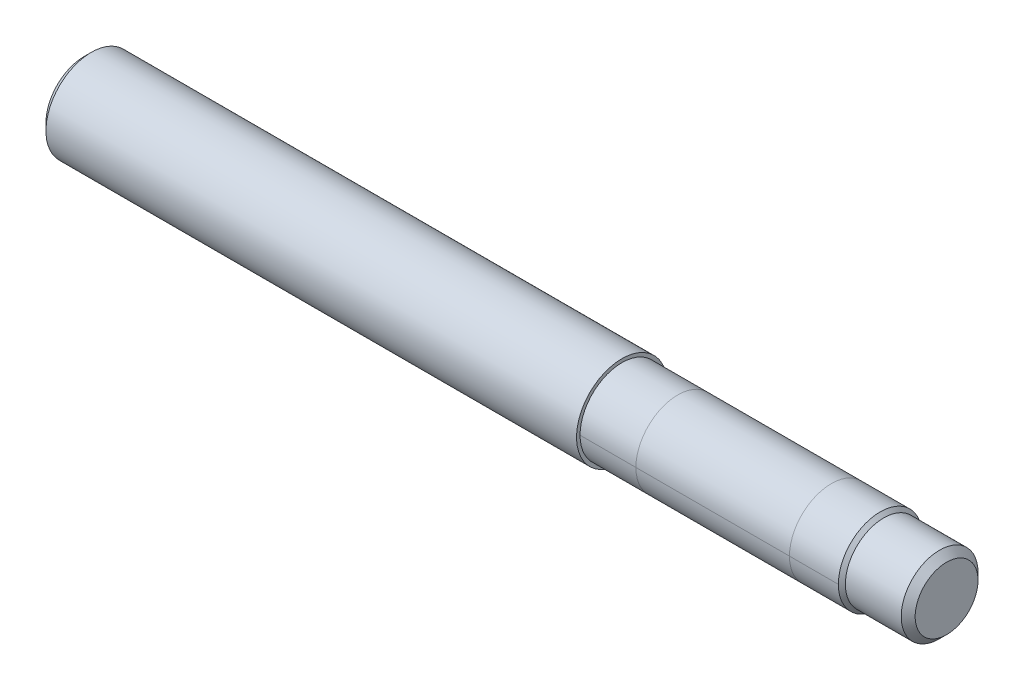
ISO-10303-21;
HEADER;
FILE_DESCRIPTION(('STEP AP214'),'2;1');
FILE_NAME('part.step','',(''),(''),'','','');
FILE_SCHEMA(('AUTOMOTIVE_DESIGN { 1 0 10303 214 1 1 1 1 }'));
ENDSEC;
DATA;
#1=APPLICATION_CONTEXT('core data for automotive mechanical design processes');
#2=APPLICATION_PROTOCOL_DEFINITION('international standard','automotive_design',2000,#1);
#3=PRODUCT_CONTEXT('',#1,'mechanical');
#4=PRODUCT('Part','Part','',(#3));
#5=PRODUCT_RELATED_PRODUCT_CATEGORY('part','',(#4));
#6=PRODUCT_DEFINITION_FORMATION('','',#4);
#7=PRODUCT_DEFINITION_CONTEXT('part definition',#1,'design');
#8=PRODUCT_DEFINITION('design','',#6,#7);
#9=PRODUCT_DEFINITION_SHAPE('','',#8);
#10=(LENGTH_UNIT() NAMED_UNIT(*) SI_UNIT(.MILLI.,.METRE.));
#11=(NAMED_UNIT(*) PLANE_ANGLE_UNIT() SI_UNIT($,.RADIAN.));
#12=(NAMED_UNIT(*) SI_UNIT($,.STERADIAN.) SOLID_ANGLE_UNIT());
#13=UNCERTAINTY_MEASURE_WITH_UNIT(LENGTH_MEASURE(1.E-05),#10,'distance_accuracy_value','');
#14=(GEOMETRIC_REPRESENTATION_CONTEXT(3) GLOBAL_UNCERTAINTY_ASSIGNED_CONTEXT((#13)) GLOBAL_UNIT_ASSIGNED_CONTEXT((#10,
#11,#12)) REPRESENTATION_CONTEXT('',''));
#15=CARTESIAN_POINT('',(0.,0.,0.));
#16=DIRECTION('',(0.,0.,1.));
#17=DIRECTION('',(1.,0.,0.));
#18=AXIS2_PLACEMENT_3D('',#15,#16,#17);
#19=CARTESIAN_POINT('',(77.,0.,0.));
#20=DIRECTION('',(1.,0.,0.));
#21=DIRECTION('',(0.,0.,-1.));
#22=AXIS2_PLACEMENT_3D('',#19,#20,#21);
#23=CYLINDRICAL_SURFACE('',#22,6.);
#24=CARTESIAN_POINT('',(106.9974,0.,0.));
#25=DIRECTION('',(1.,0.,0.));
#26=DIRECTION('',(0.,0.,-1.));
#27=AXIS2_PLACEMENT_3D('',#24,#25,#26);
#28=CIRCLE('',#27,6.);
#29=CARTESIAN_POINT('',(106.9974,0.,-6.));
#30=VERTEX_POINT('',#29);
#31=CARTESIAN_POINT('',(106.9974,-6.,0.));
#32=VERTEX_POINT('',#31);
#33=EDGE_CURVE('E43',#30,#32,#28,.F.);
#34=ORIENTED_EDGE('',*,*,#33,.T.);
#35=CARTESIAN_POINT('',(106.9974,0.,6.));
#36=VERTEX_POINT('',#35);
#37=EDGE_CURVE('E12',#32,#36,#28,.F.);
#38=ORIENTED_EDGE('',*,*,#37,.T.);
#39=DIRECTION('',(1.,0.,0.));
#40=VECTOR('',#39,1.);
#41=CARTESIAN_POINT('',(77.,0.,6.));
#42=LINE('',#41,#40);
#43=CARTESIAN_POINT('',(85.001,0.,6.));
#44=VERTEX_POINT('',#43);
#45=EDGE_CURVE('E96',#36,#44,#42,.F.);
#46=ORIENTED_EDGE('',*,*,#45,.T.);
#47=CARTESIAN_POINT('',(85.001,0.,0.));
#48=DIRECTION('',(1.,0.,0.));
#49=DIRECTION('',(0.,0.,-1.));
#50=AXIS2_PLACEMENT_3D('',#47,#48,#49);
#51=CIRCLE('',#50,6.);
#52=CARTESIAN_POINT('',(85.001,-6.,0.));
#53=VERTEX_POINT('',#52);
#54=EDGE_CURVE('E131',#53,#44,#51,.F.);
#55=ORIENTED_EDGE('',*,*,#54,.F.);
#56=CARTESIAN_POINT('',(85.001,0.,-6.));
#57=VERTEX_POINT('',#56);
#58=EDGE_CURVE('E135',#57,#53,#51,.F.);
#59=ORIENTED_EDGE('',*,*,#58,.F.);
#60=DIRECTION('',(1.,0.,0.));
#61=VECTOR('',#60,1.);
#62=CARTESIAN_POINT('',(77.,0.,-6.));
#63=LINE('',#62,#61);
#64=EDGE_CURVE('E129',#57,#30,#63,.T.);
#65=ORIENTED_EDGE('',*,*,#64,.T.);
#66=EDGE_LOOP('',(#34,#38,#46,#55,#59,#65));
#67=FACE_BOUND('',#66,.T.);
#68=ADVANCED_FACE('F33',(#67),#23,.T.);
#69=ORIENTED_EDGE('',*,*,#45,.F.);
#70=CARTESIAN_POINT('',(106.9974,0.,0.));
#71=DIRECTION('',(1.,0.,0.));
#72=DIRECTION('',(0.,0.,-1.));
#73=AXIS2_PLACEMENT_3D('',#70,#71,#72);
#74=CIRCLE('',#73,6.);
#75=CARTESIAN_POINT('',(106.9974,6.,0.));
#76=VERTEX_POINT('',#75);
#77=EDGE_CURVE('E56',#36,#76,#74,.F.);
#78=ORIENTED_EDGE('',*,*,#77,.T.);
#79=EDGE_CURVE('E37',#76,#30,#74,.F.);
#80=ORIENTED_EDGE('',*,*,#79,.T.);
#81=ORIENTED_EDGE('',*,*,#64,.F.);
#82=CARTESIAN_POINT('',(85.001,0.,0.));
#83=DIRECTION('',(1.,0.,0.));
#84=DIRECTION('',(0.,0.,-1.));
#85=AXIS2_PLACEMENT_3D('',#82,#83,#84);
#86=CIRCLE('',#85,6.);
#87=CARTESIAN_POINT('',(85.001,6.,0.));
#88=VERTEX_POINT('',#87);
#89=EDGE_CURVE('E95',#88,#57,#86,.F.);
#90=ORIENTED_EDGE('',*,*,#89,.F.);
#91=EDGE_CURVE('E138',#44,#88,#86,.F.);
#92=ORIENTED_EDGE('',*,*,#91,.F.);
#93=EDGE_LOOP('',(#69,#78,#80,#81,#90,#92));
#94=FACE_BOUND('',#93,.T.);
#95=ADVANCED_FACE('F191',(#94),#23,.T.);
#96=ORIENTED_EDGE('',*,*,#58,.T.);
#97=ORIENTED_EDGE('',*,*,#54,.T.);
#98=CARTESIAN_POINT('',(77.,0.,6.));
#99=VERTEX_POINT('',#98);
#100=EDGE_CURVE('E98',#44,#99,#42,.F.);
#101=ORIENTED_EDGE('',*,*,#100,.T.);
#102=CARTESIAN_POINT('',(77.,0.,0.));
#103=DIRECTION('',(1.,0.,0.));
#104=DIRECTION('',(0.,0.,-1.));
#105=AXIS2_PLACEMENT_3D('',#102,#103,#104);
#106=CIRCLE('',#105,6.);
#107=CARTESIAN_POINT('',(77.,0.,-6.));
#108=VERTEX_POINT('',#107);
#109=EDGE_CURVE('E107',#99,#108,#106,.T.);
#110=ORIENTED_EDGE('',*,*,#109,.T.);
#111=EDGE_CURVE('E126',#108,#57,#63,.T.);
#112=ORIENTED_EDGE('',*,*,#111,.T.);
#113=EDGE_LOOP('',(#96,#97,#101,#110,#112));
#114=FACE_BOUND('',#113,.T.);
#115=ADVANCED_FACE('F155',(#114),#23,.T.);
#116=ORIENTED_EDGE('',*,*,#100,.F.);
#117=ORIENTED_EDGE('',*,*,#91,.T.);
#118=ORIENTED_EDGE('',*,*,#89,.T.);
#119=ORIENTED_EDGE('',*,*,#111,.F.);
#120=EDGE_CURVE('E109',#108,#99,#106,.T.);
#121=ORIENTED_EDGE('',*,*,#120,.T.);
#122=EDGE_LOOP('',(#116,#117,#118,#119,#121));
#123=FACE_BOUND('',#122,.T.);
#124=ADVANCED_FACE('F171',(#123),#23,.T.);
#125=ORIENTED_EDGE('',*,*,#37,.F.);
#126=ORIENTED_EDGE('',*,*,#33,.F.);
#127=CARTESIAN_POINT('',(114.,0.,-6.));
#128=VERTEX_POINT('',#127);
#129=EDGE_CURVE('E106',#30,#128,#63,.T.);
#130=ORIENTED_EDGE('',*,*,#129,.T.);
#131=CARTESIAN_POINT('',(114.,0.,0.));
#132=DIRECTION('',(-1.,0.,0.));
#133=DIRECTION('',(0.,0.,1.));
#134=AXIS2_PLACEMENT_3D('',#131,#132,#133);
#135=CIRCLE('',#134,6.);
#136=CARTESIAN_POINT('',(114.,0.,6.));
#137=VERTEX_POINT('',#136);
#138=EDGE_CURVE('E102',#137,#128,#135,.F.);
#139=ORIENTED_EDGE('',*,*,#138,.F.);
#140=EDGE_CURVE('E87',#137,#36,#42,.F.);
#141=ORIENTED_EDGE('',*,*,#140,.T.);
#142=EDGE_LOOP('',(#125,#126,#130,#139,#141));
#143=FACE_BOUND('',#142,.T.);
#144=ADVANCED_FACE('F105',(#143),#23,.T.);
#145=CARTESIAN_POINT('',(123.5,0.,0.));
#146=DIRECTION('',(-1.,0.,0.));
#147=DIRECTION('',(0.,0.,1.));
#148=AXIS2_PLACEMENT_3D('',#145,#146,#147);
#149=CYLINDRICAL_SURFACE('',#148,6.5);
#150=CARTESIAN_POINT('',(1.00000000000001,0.,0.));
#151=DIRECTION('',(1.,0.,0.));
#152=DIRECTION('',(0.,0.,-1.));
#153=AXIS2_PLACEMENT_3D('',#150,#151,#152);
#154=CIRCLE('',#153,6.5);
#155=CARTESIAN_POINT('',(1.00000000000001,0.,-6.5));
#156=VERTEX_POINT('',#155);
#157=EDGE_CURVE('E114',#156,#156,#154,.T.);
#158=ORIENTED_EDGE('',*,*,#157,.T.);
#159=EDGE_LOOP('',(#158));
#160=FACE_BOUND('',#159,.T.);
#161=CARTESIAN_POINT('',(77.,0.,0.));
#162=DIRECTION('',(1.,0.,0.));
#163=DIRECTION('',(0.,0.,-1.));
#164=AXIS2_PLACEMENT_3D('',#161,#162,#163);
#165=CIRCLE('',#164,6.5);
#166=CARTESIAN_POINT('',(77.,0.,-6.5));
#167=VERTEX_POINT('',#166);
#168=EDGE_CURVE('E113',#167,#167,#165,.T.);
#169=ORIENTED_EDGE('',*,*,#168,.F.);
#170=EDGE_LOOP('',(#169));
#171=FACE_BOUND('',#170,.T.);
#172=ADVANCED_FACE('F203',(#160,#171),#149,.T.);
#173=CARTESIAN_POINT('',(0.,0.,0.));
#174=DIRECTION('',(1.,0.,0.));
#175=DIRECTION('',(0.,0.,-1.));
#176=AXIS2_PLACEMENT_3D('',#173,#174,#175);
#177=PLANE('',#176);
#178=CARTESIAN_POINT('',(0.,0.,0.));
#179=DIRECTION('',(1.,0.,0.));
#180=DIRECTION('',(0.,0.,-1.));
#181=AXIS2_PLACEMENT_3D('',#178,#179,#180);
#182=CIRCLE('',#181,5.49999999999999);
#183=CARTESIAN_POINT('',(0.,0.,-5.49999999999999));
#184=VERTEX_POINT('',#183);
#185=EDGE_CURVE('E117',#184,#184,#182,.F.);
#186=ORIENTED_EDGE('',*,*,#185,.T.);
#187=EDGE_LOOP('',(#186));
#188=FACE_BOUND('',#187,.T.);
#189=ADVANCED_FACE('F201',(#188),#177,.F.);
#190=CARTESIAN_POINT('',(77.,0.,0.));
#191=DIRECTION('',(1.,0.,0.));
#192=DIRECTION('',(0.,0.,-1.));
#193=AXIS2_PLACEMENT_3D('',#190,#191,#192);
#194=PLANE('',#193);
#195=ORIENTED_EDGE('',*,*,#120,.F.);
#196=ORIENTED_EDGE('',*,*,#109,.F.);
#197=EDGE_LOOP('',(#195,#196));
#198=FACE_BOUND('',#197,.T.);
#199=ORIENTED_EDGE('',*,*,#168,.T.);
#200=EDGE_LOOP('',(#199));
#201=FACE_BOUND('',#200,.T.);
#202=ADVANCED_FACE('F169',(#198,#201),#194,.T.);
#203=ORIENTED_EDGE('',*,*,#77,.F.);
#204=ORIENTED_EDGE('',*,*,#140,.F.);
#205=EDGE_CURVE('E91',#128,#137,#135,.F.);
#206=ORIENTED_EDGE('',*,*,#205,.F.);
#207=ORIENTED_EDGE('',*,*,#129,.F.);
#208=ORIENTED_EDGE('',*,*,#79,.F.);
#209=EDGE_LOOP('',(#203,#204,#206,#207,#208));
#210=FACE_BOUND('',#209,.T.);
#211=ADVANCED_FACE('F89',(#210),#23,.T.);
#212=CARTESIAN_POINT('',(127.965017678963,0.,0.));
#213=DIRECTION('',(1.,0.,0.));
#214=DIRECTION('',(0.,0.,-1.));
#215=AXIS2_PLACEMENT_3D('',#212,#213,#214);
#216=CYLINDRICAL_SURFACE('',#215,5.5);
#217=CARTESIAN_POINT('',(122.5,0.,0.));
#218=DIRECTION('',(1.,0.,0.));
#219=DIRECTION('',(0.,0.,-1.));
#220=AXIS2_PLACEMENT_3D('',#217,#218,#219);
#221=CIRCLE('',#220,5.5);
#222=CARTESIAN_POINT('',(122.5,0.,-5.5));
#223=VERTEX_POINT('',#222);
#224=EDGE_CURVE('E123',#223,#223,#221,.F.);
#225=ORIENTED_EDGE('',*,*,#224,.T.);
#226=EDGE_LOOP('',(#225));
#227=FACE_BOUND('',#226,.T.);
#228=CARTESIAN_POINT('',(114.5,0.,0.));
#229=DIRECTION('',(1.,0.,0.));
#230=DIRECTION('',(0.,0.,-1.));
#231=AXIS2_PLACEMENT_3D('',#228,#229,#230);
#232=CIRCLE('',#231,5.5);
#233=CARTESIAN_POINT('',(114.5,0.,-5.5));
#234=VERTEX_POINT('',#233);
#235=EDGE_CURVE('E103',#234,#234,#232,.T.);
#236=ORIENTED_EDGE('',*,*,#235,.T.);
#237=EDGE_LOOP('',(#236));
#238=FACE_BOUND('',#237,.T.);
#239=ADVANCED_FACE('F177',(#227,#238),#216,.T.);
#240=CARTESIAN_POINT('',(112.600148555253,0.,0.));
#241=DIRECTION('',(-1.,0.,0.));
#242=DIRECTION('',(0.,0.,1.));
#243=AXIS2_PLACEMENT_3D('',#240,#241,#242);
#244=CONICAL_SURFACE('',#243,7.39985144474733,0.785398163397453);
#245=ORIENTED_EDGE('',*,*,#138,.T.);
#246=ORIENTED_EDGE('',*,*,#205,.T.);
#247=EDGE_LOOP('',(#245,#246));
#248=FACE_BOUND('',#247,.T.);
#249=ORIENTED_EDGE('',*,*,#235,.F.);
#250=EDGE_LOOP('',(#249));
#251=FACE_BOUND('',#250,.T.);
#252=ADVANCED_FACE('F100',(#248,#251),#244,.T.);
#253=CARTESIAN_POINT('',(123.5,0.,0.));
#254=DIRECTION('',(1.,0.,0.));
#255=DIRECTION('',(0.,0.,-1.));
#256=AXIS2_PLACEMENT_3D('',#253,#254,#255);
#257=PLANE('',#256);
#258=CARTESIAN_POINT('',(123.5,0.,0.));
#259=DIRECTION('',(1.,0.,0.));
#260=DIRECTION('',(0.,0.,-1.));
#261=AXIS2_PLACEMENT_3D('',#258,#259,#260);
#262=CIRCLE('',#261,4.5);
#263=CARTESIAN_POINT('',(123.5,0.,-4.5));
#264=VERTEX_POINT('',#263);
#265=EDGE_CURVE('E120',#264,#264,#262,.T.);
#266=ORIENTED_EDGE('',*,*,#265,.T.);
#267=EDGE_LOOP('',(#266));
#268=FACE_BOUND('',#267,.T.);
#269=ADVANCED_FACE('F179',(#268),#257,.T.);
#270=CARTESIAN_POINT('',(1.00000000000001,0.,0.));
#271=DIRECTION('',(1.,0.,0.));
#272=DIRECTION('',(0.,0.,-1.));
#273=AXIS2_PLACEMENT_3D('',#270,#271,#272);
#274=CONICAL_SURFACE('',#273,6.5,0.785398163397448);
#275=ORIENTED_EDGE('',*,*,#185,.F.);
#276=EDGE_LOOP('',(#275));
#277=FACE_BOUND('',#276,.T.);
#278=ORIENTED_EDGE('',*,*,#157,.F.);
#279=EDGE_LOOP('',(#278));
#280=FACE_BOUND('',#279,.T.);
#281=ADVANCED_FACE('F185',(#277,#280),#274,.T.);
#282=CARTESIAN_POINT('',(123.5,0.,0.));
#283=DIRECTION('',(-1.,0.,0.));
#284=DIRECTION('',(0.,0.,1.));
#285=AXIS2_PLACEMENT_3D('',#282,#283,#284);
#286=CONICAL_SURFACE('',#285,4.5,0.785398163397441);
#287=ORIENTED_EDGE('',*,*,#224,.F.);
#288=EDGE_LOOP('',(#287));
#289=FACE_BOUND('',#288,.T.);
#290=ORIENTED_EDGE('',*,*,#265,.F.);
#291=EDGE_LOOP('',(#290));
#292=FACE_BOUND('',#291,.T.);
#293=ADVANCED_FACE('F35',(#289,#292),#286,.T.);
#294=CLOSED_SHELL('',(#68,#95,#115,#124,#144,#172,#189,#202,#211,#239,#252,#269,#281,#293));
#295=MANIFOLD_SOLID_BREP('B2',#294);
#296=ADVANCED_BREP_SHAPE_REPRESENTATION('',(#18,#295),#14);
#297=SHAPE_DEFINITION_REPRESENTATION(#9,#296);
ENDSEC;
END-ISO-10303-21;
